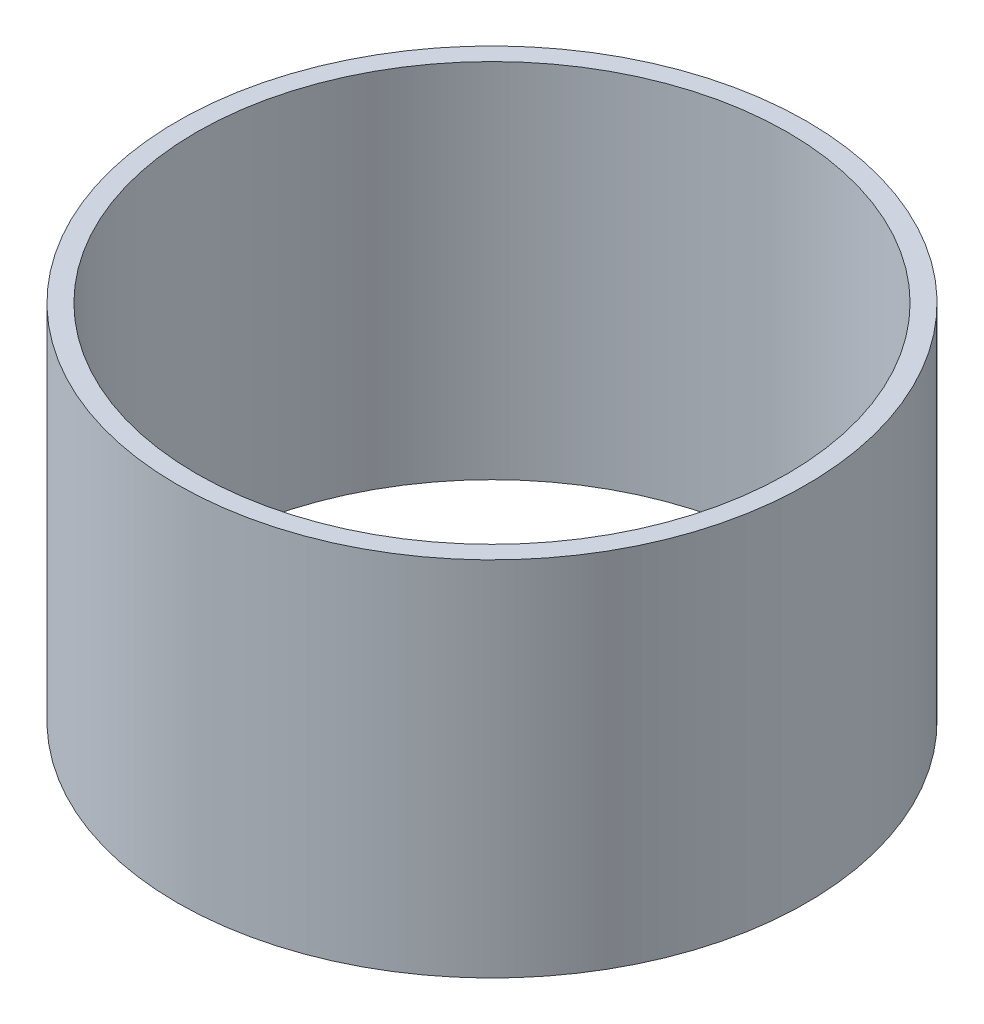
ISO-10303-21;
HEADER;
FILE_DESCRIPTION(('STEP AP214'),'2;1');
FILE_NAME('part.step','',(''),(''),'','','');
FILE_SCHEMA(('AUTOMOTIVE_DESIGN { 1 0 10303 214 1 1 1 1 }'));
ENDSEC;
DATA;
#1=APPLICATION_CONTEXT('core data for automotive mechanical design processes');
#2=APPLICATION_PROTOCOL_DEFINITION('international standard','automotive_design',2000,#1);
#3=PRODUCT_CONTEXT('',#1,'mechanical');
#4=PRODUCT('Part','Part','',(#3));
#5=PRODUCT_RELATED_PRODUCT_CATEGORY('part','',(#4));
#6=PRODUCT_DEFINITION_FORMATION('','',#4);
#7=PRODUCT_DEFINITION_CONTEXT('part definition',#1,'design');
#8=PRODUCT_DEFINITION('design','',#6,#7);
#9=PRODUCT_DEFINITION_SHAPE('','',#8);
#10=(LENGTH_UNIT() NAMED_UNIT(*) SI_UNIT(.MILLI.,.METRE.));
#11=(NAMED_UNIT(*) PLANE_ANGLE_UNIT() SI_UNIT($,.RADIAN.));
#12=(NAMED_UNIT(*) SI_UNIT($,.STERADIAN.) SOLID_ANGLE_UNIT());
#13=UNCERTAINTY_MEASURE_WITH_UNIT(LENGTH_MEASURE(1.E-05),#10,'distance_accuracy_value','');
#14=(GEOMETRIC_REPRESENTATION_CONTEXT(3) GLOBAL_UNCERTAINTY_ASSIGNED_CONTEXT((#13)) GLOBAL_UNIT_ASSIGNED_CONTEXT((#10,
#11,#12)) REPRESENTATION_CONTEXT('',''));
#15=CARTESIAN_POINT('',(0.,0.,0.));
#16=DIRECTION('',(0.,0.,1.));
#17=DIRECTION('',(1.,0.,0.));
#18=AXIS2_PLACEMENT_3D('',#15,#16,#17);
#19=CARTESIAN_POINT('',(0.,12.7,0.));
#20=DIRECTION('',(0.,1.,0.));
#21=DIRECTION('',(0.,0.,1.));
#22=AXIS2_PLACEMENT_3D('',#19,#20,#21);
#23=PLANE('',#22);
#24=CARTESIAN_POINT('',(0.,12.7,0.));
#25=DIRECTION('',(0.,1.,0.));
#26=DIRECTION('',(0.,0.,1.));
#27=AXIS2_PLACEMENT_3D('',#24,#25,#26);
#28=CIRCLE('',#27,11.0375);
#29=CARTESIAN_POINT('',(0.,12.7,11.0375));
#30=VERTEX_POINT('',#29);
#31=EDGE_CURVE('E10',#30,#30,#28,.T.);
#32=ORIENTED_EDGE('',*,*,#31,.T.);
#33=EDGE_LOOP('',(#32));
#34=FACE_BOUND('',#33,.T.);
#35=CARTESIAN_POINT('',(0.,12.7,0.));
#36=DIRECTION('',(0.,1.,0.));
#37=DIRECTION('',(0.,0.,1.));
#38=AXIS2_PLACEMENT_3D('',#35,#36,#37);
#39=CIRCLE('',#38,10.36875);
#40=CARTESIAN_POINT('',(0.,12.7,10.36875));
#41=VERTEX_POINT('',#40);
#42=EDGE_CURVE('E42',#41,#41,#39,.T.);
#43=ORIENTED_EDGE('',*,*,#42,.F.);
#44=EDGE_LOOP('',(#43));
#45=FACE_BOUND('',#44,.T.);
#46=ADVANCED_FACE('F31',(#34,#45),#23,.T.);
#47=CARTESIAN_POINT('',(0.,0.,0.));
#48=DIRECTION('',(0.,1.,0.));
#49=DIRECTION('',(0.,0.,1.));
#50=AXIS2_PLACEMENT_3D('',#47,#48,#49);
#51=PLANE('',#50);
#52=CARTESIAN_POINT('',(0.,0.,0.));
#53=DIRECTION('',(0.,1.,0.));
#54=DIRECTION('',(0.,0.,1.));
#55=AXIS2_PLACEMENT_3D('',#52,#53,#54);
#56=CIRCLE('',#55,11.0375);
#57=CARTESIAN_POINT('',(0.,0.,11.0375));
#58=VERTEX_POINT('',#57);
#59=EDGE_CURVE('E35',#58,#58,#56,.T.);
#60=ORIENTED_EDGE('',*,*,#59,.F.);
#61=EDGE_LOOP('',(#60));
#62=FACE_BOUND('',#61,.T.);
#63=CARTESIAN_POINT('',(0.,0.,0.));
#64=DIRECTION('',(0.,1.,0.));
#65=DIRECTION('',(0.,0.,1.));
#66=AXIS2_PLACEMENT_3D('',#63,#64,#65);
#67=CIRCLE('',#66,10.36875);
#68=CARTESIAN_POINT('',(0.,0.,10.36875));
#69=VERTEX_POINT('',#68);
#70=EDGE_CURVE('E44',#69,#69,#67,.T.);
#71=ORIENTED_EDGE('',*,*,#70,.T.);
#72=EDGE_LOOP('',(#71));
#73=FACE_BOUND('',#72,.T.);
#74=ADVANCED_FACE('F54',(#62,#73),#51,.F.);
#75=CARTESIAN_POINT('',(0.,12.7,0.));
#76=DIRECTION('',(0.,-1.,0.));
#77=DIRECTION('',(0.,0.,-1.));
#78=AXIS2_PLACEMENT_3D('',#75,#76,#77);
#79=CYLINDRICAL_SURFACE('',#78,11.0375);
#80=ORIENTED_EDGE('',*,*,#31,.F.);
#81=EDGE_LOOP('',(#80));
#82=FACE_BOUND('',#81,.T.);
#83=ORIENTED_EDGE('',*,*,#59,.T.);
#84=EDGE_LOOP('',(#83));
#85=FACE_BOUND('',#84,.T.);
#86=ADVANCED_FACE('F33',(#82,#85),#79,.T.);
#87=CARTESIAN_POINT('',(0.,12.7,0.));
#88=DIRECTION('',(0.,-1.,0.));
#89=DIRECTION('',(0.,0.,-1.));
#90=AXIS2_PLACEMENT_3D('',#87,#88,#89);
#91=CYLINDRICAL_SURFACE('',#90,10.36875);
#92=ORIENTED_EDGE('',*,*,#42,.T.);
#93=EDGE_LOOP('',(#92));
#94=FACE_BOUND('',#93,.T.);
#95=ORIENTED_EDGE('',*,*,#70,.F.);
#96=EDGE_LOOP('',(#95));
#97=FACE_BOUND('',#96,.T.);
#98=ADVANCED_FACE('F50',(#94,#97),#91,.F.);
#99=CLOSED_SHELL('',(#46,#74,#86,#98));
#100=MANIFOLD_SOLID_BREP('B2',#99);
#101=ADVANCED_BREP_SHAPE_REPRESENTATION('',(#18,#100),#14);
#102=SHAPE_DEFINITION_REPRESENTATION(#9,#101);
ENDSEC;
END-ISO-10303-21;
